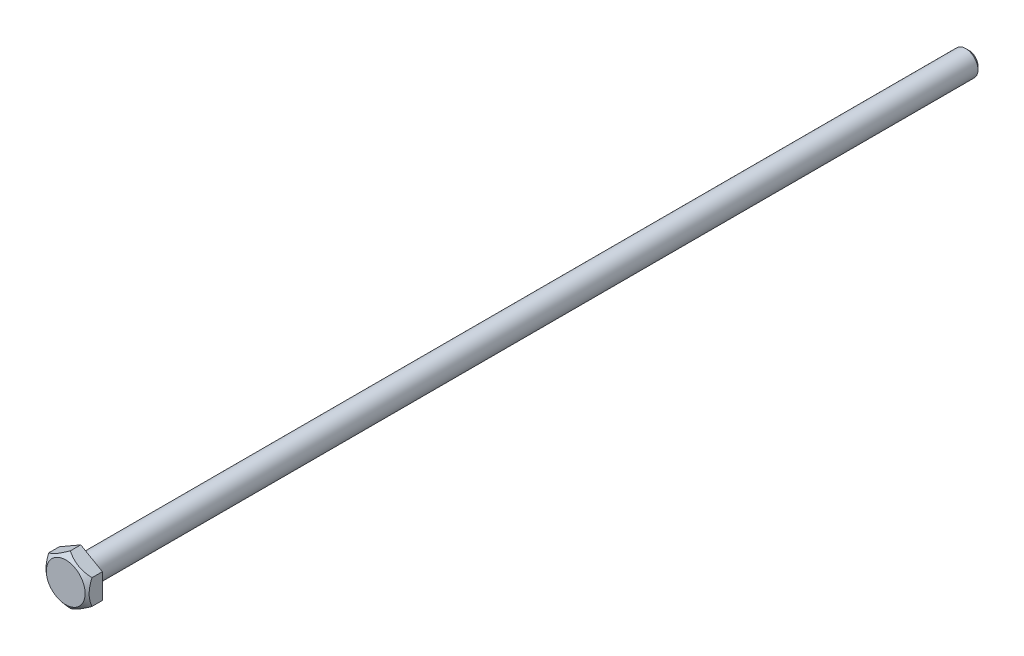
ISO-10303-21;
HEADER;
FILE_DESCRIPTION(('STEP AP214'),'2;1');
FILE_NAME('part.step','',(''),(''),'','','');
FILE_SCHEMA(('AUTOMOTIVE_DESIGN { 1 0 10303 214 1 1 1 1 }'));
ENDSEC;
DATA;
#1=APPLICATION_CONTEXT('core data for automotive mechanical design processes');
#2=APPLICATION_PROTOCOL_DEFINITION('international standard','automotive_design',2000,#1);
#3=PRODUCT_CONTEXT('',#1,'mechanical');
#4=PRODUCT('Part','Part','',(#3));
#5=PRODUCT_RELATED_PRODUCT_CATEGORY('part','',(#4));
#6=PRODUCT_DEFINITION_FORMATION('','',#4);
#7=PRODUCT_DEFINITION_CONTEXT('part definition',#1,'design');
#8=PRODUCT_DEFINITION('design','',#6,#7);
#9=PRODUCT_DEFINITION_SHAPE('','',#8);
#10=(LENGTH_UNIT() NAMED_UNIT(*) SI_UNIT(.MILLI.,.METRE.));
#11=(NAMED_UNIT(*) PLANE_ANGLE_UNIT() SI_UNIT($,.RADIAN.));
#12=(NAMED_UNIT(*) SI_UNIT($,.STERADIAN.) SOLID_ANGLE_UNIT());
#13=UNCERTAINTY_MEASURE_WITH_UNIT(LENGTH_MEASURE(1.E-05),#10,'distance_accuracy_value','');
#14=(GEOMETRIC_REPRESENTATION_CONTEXT(3) GLOBAL_UNCERTAINTY_ASSIGNED_CONTEXT((#13)) GLOBAL_UNIT_ASSIGNED_CONTEXT((#10,
#11,#12)) REPRESENTATION_CONTEXT('',''));
#15=CARTESIAN_POINT('',(0.,0.,0.));
#16=DIRECTION('',(0.,0.,1.));
#17=DIRECTION('',(1.,0.,0.));
#18=AXIS2_PLACEMENT_3D('',#15,#16,#17);
#19=CARTESIAN_POINT('',(0.,0.,0.));
#20=DIRECTION('',(0.,0.,1.));
#21=DIRECTION('',(1.,0.,0.));
#22=AXIS2_PLACEMENT_3D('',#19,#20,#21);
#23=PLANE('',#22);
#24=CARTESIAN_POINT('',(0.,0.,0.));
#25=DIRECTION('',(0.,0.,-1.));
#26=DIRECTION('',(-1.,0.,0.));
#27=AXIS2_PLACEMENT_3D('',#24,#25,#26);
#28=CIRCLE('',#27,3.17500000000001);
#29=CARTESIAN_POINT('',(-3.17500000000001,0.,0.));
#30=VERTEX_POINT('',#29);
#31=EDGE_CURVE('E112',#30,#30,#28,.T.);
#32=ORIENTED_EDGE('',*,*,#31,.F.);
#33=EDGE_LOOP('',(#32));
#34=FACE_BOUND('',#33,.T.);
#35=CARTESIAN_POINT('',(0.,0.,0.));
#36=DIRECTION('',(0.,0.,-1.));
#37=DIRECTION('',(-1.,0.,0.));
#38=AXIS2_PLACEMENT_3D('',#35,#36,#37);
#39=CIRCLE('',#38,5.2784375);
#40=CARTESIAN_POINT('',(-5.2784375,0.,0.));
#41=VERTEX_POINT('',#40);
#42=EDGE_CURVE('E133',#41,#41,#39,.T.);
#43=ORIENTED_EDGE('',*,*,#42,.T.);
#44=EDGE_LOOP('',(#43));
#45=FACE_BOUND('',#44,.T.);
#46=ADVANCED_FACE('F37',(#34,#45),#23,.F.);
#47=CARTESIAN_POINT('',(0.,2.28600000000002,-228.6));
#48=DIRECTION('',(0.,0.,-1.));
#49=DIRECTION('',(-1.,0.,0.));
#50=AXIS2_PLACEMENT_3D('',#47,#48,#49);
#51=PLANE('',#50);
#52=CARTESIAN_POINT('',(0.,0.,-228.6));
#53=DIRECTION('',(0.,0.,-1.));
#54=DIRECTION('',(-1.,0.,0.));
#55=AXIS2_PLACEMENT_3D('',#52,#53,#54);
#56=CIRCLE('',#55,2.28600000000002);
#57=CARTESIAN_POINT('',(-2.28600000000002,0.,-228.6));
#58=VERTEX_POINT('',#57);
#59=EDGE_CURVE('E118',#58,#58,#56,.T.);
#60=ORIENTED_EDGE('',*,*,#59,.T.);
#61=EDGE_LOOP('',(#60));
#62=FACE_BOUND('',#61,.T.);
#63=ADVANCED_FACE('F39',(#62),#51,.T.);
#64=CARTESIAN_POINT('',(0.,0.,-228.6));
#65=DIRECTION('',(0.,0.,-1.));
#66=DIRECTION('',(-1.,0.,0.));
#67=AXIS2_PLACEMENT_3D('',#64,#65,#66);
#68=CYLINDRICAL_SURFACE('',#67,3.17500000000001);
#69=ORIENTED_EDGE('',*,*,#31,.T.);
#70=EDGE_LOOP('',(#69));
#71=FACE_BOUND('',#70,.T.);
#72=CARTESIAN_POINT('',(0.,0.,-227.711));
#73=DIRECTION('',(0.,0.,-1.));
#74=DIRECTION('',(-1.,0.,0.));
#75=AXIS2_PLACEMENT_3D('',#72,#73,#74);
#76=CIRCLE('',#75,3.17500000000001);
#77=CARTESIAN_POINT('',(-3.17500000000001,0.,-227.711));
#78=VERTEX_POINT('',#77);
#79=EDGE_CURVE('E45',#78,#78,#76,.T.);
#80=ORIENTED_EDGE('',*,*,#79,.F.);
#81=EDGE_LOOP('',(#80));
#82=FACE_BOUND('',#81,.T.);
#83=ADVANCED_FACE('F125',(#71,#82),#68,.T.);
#84=CARTESIAN_POINT('',(0.,0.,-228.6));
#85=DIRECTION('',(0.,0.,1.));
#86=DIRECTION('',(1.,0.,0.));
#87=AXIS2_PLACEMENT_3D('',#84,#85,#86);
#88=CONICAL_SURFACE('',#87,2.28600000000002,0.785398163397431);
#89=ORIENTED_EDGE('',*,*,#79,.T.);
#90=EDGE_LOOP('',(#89));
#91=FACE_BOUND('',#90,.T.);
#92=ORIENTED_EDGE('',*,*,#59,.F.);
#93=EDGE_LOOP('',(#92));
#94=FACE_BOUND('',#93,.T.);
#95=ADVANCED_FACE('F214',(#91,#94),#88,.T.);
#96=CARTESIAN_POINT('',(0.,0.,0.09921875));
#97=DIRECTION('',(0.,0.,-1.));
#98=DIRECTION('',(-1.,0.,0.));
#99=AXIS2_PLACEMENT_3D('',#96,#97,#98);
#100=PLANE('',#99);
#101=CARTESIAN_POINT('',(0.,0.,0.09921875));
#102=DIRECTION('',(0.,0.,-1.));
#103=DIRECTION('',(-1.,0.,0.));
#104=AXIS2_PLACEMENT_3D('',#101,#102,#103);
#105=CIRCLE('',#104,5.2784375);
#106=CARTESIAN_POINT('',(-5.2784375,0.,0.09921875));
#107=VERTEX_POINT('',#106);
#108=EDGE_CURVE('E135',#107,#107,#105,.T.);
#109=ORIENTED_EDGE('',*,*,#108,.F.);
#110=EDGE_LOOP('',(#109));
#111=FACE_BOUND('',#110,.T.);
#112=DIRECTION('',(0.866025403784439,-0.499999999999999,0.));
#113=VECTOR('',#112,1.);
#114=CARTESIAN_POINT('',(5.55625,3.20790243318486,0.0992187499999999));
#115=LINE('',#114,#113);
#116=CARTESIAN_POINT('',(0.,6.41580486636971,0.09921875));
#117=VERTEX_POINT('',#116);
#118=CARTESIAN_POINT('',(5.55625,3.20790243318486,0.0992187499999999));
#119=VERTEX_POINT('',#118);
#120=EDGE_CURVE('E51',#117,#119,#115,.T.);
#121=ORIENTED_EDGE('',*,*,#120,.T.);
#122=DIRECTION('',(0.,-1.,0.));
#123=VECTOR('',#122,1.);
#124=CARTESIAN_POINT('',(5.55625,-3.20790243318486,0.0992187499999999));
#125=LINE('',#124,#123);
#126=CARTESIAN_POINT('',(5.55625,-3.20790243318485,0.09921875));
#127=VERTEX_POINT('',#126);
#128=EDGE_CURVE('E12',#119,#127,#125,.T.);
#129=ORIENTED_EDGE('',*,*,#128,.T.);
#130=DIRECTION('',(-0.866025403784438,-0.5,0.));
#131=VECTOR('',#130,1.);
#132=CARTESIAN_POINT('',(0.,-6.41580486636972,0.0992187499999999));
#133=LINE('',#132,#131);
#134=CARTESIAN_POINT('',(0.,-6.41580486636971,0.09921875));
#135=VERTEX_POINT('',#134);
#136=EDGE_CURVE('E138',#127,#135,#133,.T.);
#137=ORIENTED_EDGE('',*,*,#136,.T.);
#138=DIRECTION('',(-0.866025403784439,0.5,0.));
#139=VECTOR('',#138,1.);
#140=CARTESIAN_POINT('',(-5.55625,-3.20790243318486,0.0992187499999999));
#141=LINE('',#140,#139);
#142=CARTESIAN_POINT('',(-5.55625,-3.20790243318486,0.09921875));
#143=VERTEX_POINT('',#142);
#144=EDGE_CURVE('E92',#135,#143,#141,.T.);
#145=ORIENTED_EDGE('',*,*,#144,.T.);
#146=DIRECTION('',(0.,1.,0.));
#147=VECTOR('',#146,1.);
#148=CARTESIAN_POINT('',(-5.55625,3.20790243318485,0.0992187499999999));
#149=LINE('',#148,#147);
#150=CARTESIAN_POINT('',(-5.55625,3.20790243318485,0.09921875));
#151=VERTEX_POINT('',#150);
#152=EDGE_CURVE('E87',#143,#151,#149,.T.);
#153=ORIENTED_EDGE('',*,*,#152,.T.);
#154=DIRECTION('',(0.866025403784438,0.5,0.));
#155=VECTOR('',#154,1.);
#156=CARTESIAN_POINT('',(0.,6.41580486636971,0.0992187499999999));
#157=LINE('',#156,#155);
#158=EDGE_CURVE('E90',#151,#117,#157,.T.);
#159=ORIENTED_EDGE('',*,*,#158,.T.);
#160=EDGE_LOOP('',(#121,#129,#137,#145,#153,#159));
#161=FACE_BOUND('',#160,.T.);
#162=ADVANCED_FACE('F89',(#111,#161),#100,.T.);
#163=CARTESIAN_POINT('',(0.,0.,0.09921875));
#164=DIRECTION('',(0.,0.,-1.));
#165=DIRECTION('',(-1.,0.,0.));
#166=AXIS2_PLACEMENT_3D('',#163,#164,#165);
#167=CYLINDRICAL_SURFACE('',#166,5.2784375);
#168=ORIENTED_EDGE('',*,*,#108,.T.);
#169=EDGE_LOOP('',(#168));
#170=FACE_BOUND('',#169,.T.);
#171=ORIENTED_EDGE('',*,*,#42,.F.);
#172=EDGE_LOOP('',(#171));
#173=FACE_BOUND('',#172,.T.);
#174=ADVANCED_FACE('F249',(#170,#173),#167,.T.);
#175=CARTESIAN_POINT('',(0.,0.,3.96875));
#176=DIRECTION('',(0.,0.,1.));
#177=DIRECTION('',(1.,0.,0.));
#178=AXIS2_PLACEMENT_3D('',#175,#176,#177);
#179=PLANE('',#178);
#180=CARTESIAN_POINT('',(0.,0.,3.96875));
#181=DIRECTION('',(0.,0.,1.));
#182=DIRECTION('',(1.,0.,0.));
#183=AXIS2_PLACEMENT_3D('',#180,#181,#182);
#184=CIRCLE('',#183,5.000625);
#185=CARTESIAN_POINT('',(5.000625,0.,3.96875));
#186=VERTEX_POINT('',#185);
#187=EDGE_CURVE('E144',#186,#186,#184,.T.);
#188=ORIENTED_EDGE('',*,*,#187,.T.);
#189=EDGE_LOOP('',(#188));
#190=FACE_BOUND('',#189,.T.);
#191=ADVANCED_FACE('F168',(#190),#179,.T.);
#192=CARTESIAN_POINT('',(0.,0.,3.96875));
#193=DIRECTION('',(0.,0.,-1.));
#194=DIRECTION('',(1.,0.,0.));
#195=AXIS2_PLACEMENT_3D('',#192,#193,#194);
#196=CONICAL_SURFACE('',#195,5.000625,0.872664625997167);
#197=ORIENTED_EDGE('',*,*,#187,.F.);
#198=EDGE_LOOP('',(#197));
#199=FACE_BOUND('',#198,.T.);
#200=CARTESIAN_POINT('',(5.55645,3.20778696313102,2.7811762025844));
#201=CARTESIAN_POINT('',(5.36942287800813,3.31576712235879,2.87174290189446));
#202=CARTESIAN_POINT('',(5.1801128777987,3.42506530193999,2.95664630651463));
#203=CARTESIAN_POINT('',(4.79640245001475,3.64660062071192,3.11186256826474));
#204=CARTESIAN_POINT('',(4.60198750929482,3.75884613907106,3.1821272314966));
#205=CARTESIAN_POINT('',(4.21055743956502,3.98483839519847,3.30361001362993));
#206=CARTESIAN_POINT('',(4.01358244229918,4.09856196289353,3.35499670765096));
#207=CARTESIAN_POINT('',(3.61644186020743,4.32785118487032,3.43602242404382));
#208=CARTESIAN_POINT('',(3.4162804755603,4.44341441417771,3.46568798738072));
#209=CARTESIAN_POINT('',(3.11317047330776,4.61841505557229,3.4922840094219));
#210=CARTESIAN_POINT('',(3.01076766145363,4.67753734656204,3.49813640306416));
#211=CARTESIAN_POINT('',(2.80583237176032,4.79585679123293,3.50350262433152));
#212=CARTESIAN_POINT('',(2.70329989840131,4.85505394232743,3.50301666528673));
#213=CARTESIAN_POINT('',(2.49836808386294,4.97337138061668,3.49570688780427));
#214=CARTESIAN_POINT('',(2.39596880596456,5.03249163127613,3.48888072486892));
#215=CARTESIAN_POINT('',(2.19161413080256,5.15047585799107,3.46905431832034));
#216=CARTESIAN_POINT('',(2.08965879940889,5.20933979601652,3.45605318802658));
#217=CARTESIAN_POINT('',(1.78488763429259,5.38529951023765,3.40819419699572));
#218=CARTESIAN_POINT('',(1.58308217780571,5.50181194486429,3.36447734474451));
#219=CARTESIAN_POINT('',(1.18361180278695,5.73244627341465,3.25674845339603));
#220=CARTESIAN_POINT('',(0.985948685577069,5.84656712734463,3.1927277725839));
#221=CARTESIAN_POINT('',(0.656416529823367,6.03682260617567,3.07083683041339));
#222=CARTESIAN_POINT('',(0.523316938331222,6.11366769115269,3.01731243824081));
#223=CARTESIAN_POINT('',(0.325533109905479,6.22785823773565,2.93215622440135));
#224=CARTESIAN_POINT('',(0.26003610932506,6.26567294865186,2.90301786600498));
#225=CARTESIAN_POINT('',(0.129541330587996,6.34101414428355,2.843211119322));
#226=CARTESIAN_POINT('',(0.0645437343024629,6.37854052399568,2.8125422015325));
#227=CARTESIAN_POINT('',(-0.000200000000004958,6.41592033642355,2.7811762025844));
#228=B_SPLINE_CURVE_WITH_KNOTS('',3,(#200,#201,#202,#203,#204,#205,#206,#207,#208,#209,#210,
#211,#212,#213,#214,#215,#216,#217,#218,#219,#220,#221,#222,#223,#224,#225,#226,#227),
.UNSPECIFIED.,.F.,.F.,(4,2,2,2,2,2,2,2,2,2,2,2,2,4),(0.,0.702831010465649,1.40794055081247,
2.10659111417631,2.80438656798393,3.15940882068105,3.51441912441572,3.8695607571038,
4.22475340097869,4.9348473642946,5.64524396430246,6.13330928727615,6.37643981877862,
6.61965505331136),.UNSPECIFIED.);
#229=CARTESIAN_POINT('',(5.55625,3.20790243318544,2.78127309607981));
#230=VERTEX_POINT('',#229);
#231=CARTESIAN_POINT('',(0.,6.41580486636971,2.78127309607966));
#232=VERTEX_POINT('',#231);
#233=EDGE_CURVE('E174',#230,#232,#228,.T.);
#234=ORIENTED_EDGE('',*,*,#233,.T.);
#235=CARTESIAN_POINT('',(0.000199999999995729,6.41592033642355,2.7811762025844));
#236=CARTESIAN_POINT('',(-0.186827121991873,6.30794017719579,2.87174290189446));
#237=CARTESIAN_POINT('',(-0.376137122201302,6.19864199761458,2.95664630651463));
#238=CARTESIAN_POINT('',(-0.759847549985247,5.97710667884266,3.11186256826474));
#239=CARTESIAN_POINT('',(-0.954262490705186,5.86486116048351,3.1821272314966));
#240=CARTESIAN_POINT('',(-1.34569256043498,5.6388689043561,3.30361001362993));
#241=CARTESIAN_POINT('',(-1.54266755770082,5.52514533666104,3.35499670765096));
#242=CARTESIAN_POINT('',(-1.93980813979257,5.29585611468425,3.43602242404382));
#243=CARTESIAN_POINT('',(-2.1399695244397,5.18029288537686,3.46568798738072));
#244=CARTESIAN_POINT('',(-2.44307952669225,5.00529224398228,3.4922840094219));
#245=CARTESIAN_POINT('',(-2.54548233854637,4.94616995299253,3.49813640306416));
#246=CARTESIAN_POINT('',(-2.75041762823968,4.82785050832164,3.50350262433152));
#247=CARTESIAN_POINT('',(-2.85295010159869,4.76865335722714,3.50301666528673));
#248=CARTESIAN_POINT('',(-3.05788191613706,4.65033591893789,3.49570688780427));
#249=CARTESIAN_POINT('',(-3.16028119403544,4.59121566827844,3.48888072486892));
#250=CARTESIAN_POINT('',(-3.36463586919744,4.4732314415635,3.46905431832034));
#251=CARTESIAN_POINT('',(-3.46659120059111,4.41436750353805,3.45605318802658));
#252=CARTESIAN_POINT('',(-3.77136236570741,4.23840778931692,3.40819419699572));
#253=CARTESIAN_POINT('',(-3.97316782219429,4.12189535469028,3.36447734474451));
#254=CARTESIAN_POINT('',(-4.37263819721305,3.89126102613992,3.25674845339603));
#255=CARTESIAN_POINT('',(-4.57030131442293,3.77714017220993,3.1927277725839));
#256=CARTESIAN_POINT('',(-4.89983347017663,3.5868846933789,3.07083683041339));
#257=CARTESIAN_POINT('',(-5.03293306166878,3.51003960840188,3.01731243824081));
#258=CARTESIAN_POINT('',(-5.23071689009452,3.39584906181892,2.93215622440135));
#259=CARTESIAN_POINT('',(-5.29621389067494,3.3580343509027,2.90301786600498));
#260=CARTESIAN_POINT('',(-5.426708669412,3.28269315527102,2.843211119322));
#261=CARTESIAN_POINT('',(-5.49170626569753,3.24516677555889,2.8125422015325));
#262=CARTESIAN_POINT('',(-5.55645,3.20778696313102,2.7811762025844));
#263=B_SPLINE_CURVE_WITH_KNOTS('',3,(#235,#236,#237,#238,#239,#240,#241,#242,#243,#244,#245,
#246,#247,#248,#249,#250,#251,#252,#253,#254,#255,#256,#257,#258,#259,#260,#261,#262),
.UNSPECIFIED.,.F.,.F.,(4,2,2,2,2,2,2,2,2,2,2,2,2,4),(0.,0.702831010465648,1.40794055081247,
2.10659111417631,2.80438656798393,3.15940882068105,3.51441912441572,3.8695607571038,
4.22475340097869,4.9348473642946,5.64524396430246,6.13330928727615,6.37643981877862,
6.61965505331136),.UNSPECIFIED.);
#264=CARTESIAN_POINT('',(-5.55625,3.20790243318544,2.78127309607981));
#265=VERTEX_POINT('',#264);
#266=EDGE_CURVE('E197',#232,#265,#263,.T.);
#267=ORIENTED_EDGE('',*,*,#266,.T.);
#268=CARTESIAN_POINT('',(-5.55625,-7.30613663453006,0.462791093083608));
#269=CARTESIAN_POINT('',(-5.55625,-7.12020973770685,0.586942504252101));
#270=CARTESIAN_POINT('',(-5.55625,-6.93349824589019,0.709937814159239));
#271=CARTESIAN_POINT('',(-5.55625,-6.55815980741665,0.953055675693383));
#272=CARTESIAN_POINT('',(-5.55625,-6.36953246148676,1.07317761023776));
#273=CARTESIAN_POINT('',(-5.55625,-5.98877139991501,1.31076066086805));
#274=CARTESIAN_POINT('',(-5.55625,-5.79662240300522,1.42819736790077));
#275=CARTESIAN_POINT('',(-5.55625,-5.40973702167827,1.65871402414128));
#276=CARTESIAN_POINT('',(-5.55625,-5.21500079738226,1.7717942412946));
#277=CARTESIAN_POINT('',(-5.55625,-4.81174502393942,1.99860663449565));
#278=CARTESIAN_POINT('',(-5.55625,-4.60305427607429,2.11203600056159));
#279=CARTESIAN_POINT('',(-5.55625,-4.18166409396964,2.33131613610535));
#280=CARTESIAN_POINT('',(-5.55625,-3.96896407627944,2.43716579161728));
#281=CARTESIAN_POINT('',(-5.55625,-3.53953841813976,2.63889062035672));
#282=CARTESIAN_POINT('',(-5.55625,-3.32282501792204,2.73479162618935));
#283=CARTESIAN_POINT('',(-5.55625,-2.88437062163604,2.91420067485783));
#284=CARTESIAN_POINT('',(-5.55625,-2.6626317338622,2.99771380764493));
#285=CARTESIAN_POINT('',(-5.55625,-2.21904432381386,3.14727736625022));
#286=CARTESIAN_POINT('',(-5.55625,-1.99732009111652,3.21369108973883));
#287=CARTESIAN_POINT('',(-5.55625,-1.54907698527521,3.32803156373685));
#288=CARTESIAN_POINT('',(-5.55625,-1.32255845489672,3.37595963118926));
#289=CARTESIAN_POINT('',(-5.55625,-0.87022264424084,3.44928939349749));
#290=CARTESIAN_POINT('',(-5.55625,-0.644473061991863,3.47509981381762));
#291=CARTESIAN_POINT('',(-5.55625,-0.191501887582105,3.5036028744068));
#292=CARTESIAN_POINT('',(-5.55625,0.0357195286344082,3.50629822863319));
#293=CARTESIAN_POINT('',(-5.55625,0.472434488391589,3.48901850551984));
#294=CARTESIAN_POINT('',(-5.55625,0.681996959984805,3.47070441531755));
#295=CARTESIAN_POINT('',(-5.55625,1.09860731025216,3.41540133303354));
#296=CARTESIAN_POINT('',(-5.55625,1.30565500844794,3.37841100862522));
#297=CARTESIAN_POINT('',(-5.55625,1.7204729739798,3.28708537520144));
#298=CARTESIAN_POINT('',(-5.55625,1.92816452143712,3.23239705931333));
#299=CARTESIAN_POINT('',(-5.55625,2.23638685185959,3.13968443975248));
#300=CARTESIAN_POINT('',(-5.55625,2.33857192969291,3.10700141946752));
#301=CARTESIAN_POINT('',(-5.55625,2.54185150655202,3.03841158687913));
#302=CARTESIAN_POINT('',(-5.55625,2.64294605057579,3.00250490816576));
#303=CARTESIAN_POINT('',(-5.55625,2.94108641581461,2.89174822540753));
#304=CARTESIAN_POINT('',(-5.55625,3.13659642966695,2.81275113672164));
#305=CARTESIAN_POINT('',(-5.55625,3.52375299718132,2.64574387779957));
#306=CARTESIAN_POINT('',(-5.55625,3.71539829221819,2.55773082630378));
#307=CARTESIAN_POINT('',(-5.55625,4.09541763878012,2.37436691962321));
#308=CARTESIAN_POINT('',(-5.55625,4.28378738398456,2.27900718588948));
#309=CARTESIAN_POINT('',(-5.55625,4.65742469570359,2.08246699995644));
#310=CARTESIAN_POINT('',(-5.55625,4.84269257054241,1.98128713076365));
#311=CARTESIAN_POINT('',(-5.55625,5.21172117135056,1.77354751044707));
#312=CARTESIAN_POINT('',(-5.55625,5.39546496722467,1.66695779464702));
#313=CARTESIAN_POINT('',(-5.55625,5.76063319278679,1.44986704172048));
#314=CARTESIAN_POINT('',(-5.55625,5.94205749908233,1.33936579767687));
#315=CARTESIAN_POINT('',(-5.55625,6.3027826054028,1.11522193375078));
#316=CARTESIAN_POINT('',(-5.55625,6.4820847427773,1.0015814612717));
#317=CARTESIAN_POINT('',(-5.55625,6.83896784115723,0.771626233299551));
#318=CARTESIAN_POINT('',(-5.55625,7.01654876260732,0.655311416553422));
#319=CARTESIAN_POINT('',(-5.55625,7.5087821524307,0.328443095819789));
#320=CARTESIAN_POINT('',(-5.55625,7.82181835713223,0.115455906973559));
#321=CARTESIAN_POINT('',(-5.55625,8.44427371229476,-0.315820081022643));
#322=CARTESIAN_POINT('',(-5.55625,8.75369227194872,-0.534109728699571));
#323=CARTESIAN_POINT('',(-5.55625,9.36548048863519,-0.971744247536536));
#324=CARTESIAN_POINT('',(-5.55625,9.66788890120855,-1.19103502023525));
#325=CARTESIAN_POINT('',(-5.55625,10.1197707024566,-1.52224374148086));
#326=CARTESIAN_POINT('',(-5.55625,10.270090128778,-1.6330109049258));
#327=CARTESIAN_POINT('',(-5.55625,10.570218718119,-1.85523158495491));
#328=CARTESIAN_POINT('',(-5.55625,10.7200278858836,-1.96668509512955));
#329=CARTESIAN_POINT('',(-5.55625,10.8696100113442,-2.07844265914501));
#330=B_SPLINE_CURVE_WITH_KNOTS('',3,(#268,#269,#270,#271,#272,#273,#274,#275,#276,#277,#278,
#279,#280,#281,#282,#283,#284,#285,#286,#287,#288,#289,#290,#291,#292,#293,#294,#295,#296,#297,
#298,#299,#300,#301,#302,#303,#304,#305,#306,#307,#308,#309,#310,#311,#312,#313,#314,#315,#316,
#317,#318,#319,#320,#321,#322,#323,#324,#325,#326,#327,#328,#329),.UNSPECIFIED.,.F.,.F.,(4,2,2,
2,2,2,2,2,2,2,2,2,2,2,2,2,2,2,2,2,2,2,2,2,2,2,2,2,2,2,4),(0.,0.670713465897782,1.34156970318055,
2.01710606570588,2.69260081287778,3.40505238162959,4.11760844312781,4.82826536266456,
5.5386294725557,6.2323501589939,6.92602141470503,7.60657902178047,8.28705672298004,
8.91723605757904,9.54746035431262,10.1911220511409,10.5129324091891,10.8347294374005,
11.4670184796742,12.0995102186696,12.7327786973341,13.3659838512028,14.0031916629135,
14.6404332329985,15.2772491923602,15.9140797518851,17.0498662469218,18.1858357096178,
19.3064582013904,19.8666242570968,20.426785089535),.UNSPECIFIED.);
#331=CARTESIAN_POINT('',(-5.55625,-3.20790243318486,2.78127309607966));
#332=VERTEX_POINT('',#331);
#333=EDGE_CURVE('E109',#265,#332,#330,.F.);
#334=ORIENTED_EDGE('',*,*,#333,.T.);
#335=CARTESIAN_POINT('',(-5.55645,-3.20778696313102,2.78117620258439));
#336=CARTESIAN_POINT('',(-5.36942287800813,-3.31576712235879,2.87174290189446));
#337=CARTESIAN_POINT('',(-5.1801128777987,-3.42506530193999,2.95664630651463));
#338=CARTESIAN_POINT('',(-4.79640245001476,-3.64660062071192,3.11186256826474));
#339=CARTESIAN_POINT('',(-4.60198750929482,-3.75884613907106,3.1821272314966));
#340=CARTESIAN_POINT('',(-4.21055743956502,-3.98483839519847,3.30361001362993));
#341=CARTESIAN_POINT('',(-4.01358244229918,-4.09856196289353,3.35499670765096));
#342=CARTESIAN_POINT('',(-3.61644186020744,-4.32785118487032,3.43602242404382));
#343=CARTESIAN_POINT('',(-3.4162804755603,-4.44341441417771,3.46568798738072));
#344=CARTESIAN_POINT('',(-3.11317047330776,-4.61841505557229,3.4922840094219));
#345=CARTESIAN_POINT('',(-3.01076766145363,-4.67753734656204,3.49813640306415));
#346=CARTESIAN_POINT('',(-2.80583237176032,-4.79585679123293,3.50350262433152));
#347=CARTESIAN_POINT('',(-2.70329989840131,-4.85505394232743,3.50301666528673));
#348=CARTESIAN_POINT('',(-2.49836808386294,-4.97337138061668,3.49570688780427));
#349=CARTESIAN_POINT('',(-2.39596880596456,-5.03249163127613,3.48888072486892));
#350=CARTESIAN_POINT('',(-2.19161413080256,-5.15047585799107,3.46905431832034));
#351=CARTESIAN_POINT('',(-2.08965879940889,-5.20933979601652,3.45605318802658));
#352=CARTESIAN_POINT('',(-1.78488763429259,-5.38529951023766,3.40819419699572));
#353=CARTESIAN_POINT('',(-1.58308217780571,-5.50181194486429,3.36447734474451));
#354=CARTESIAN_POINT('',(-1.18361180278695,-5.73244627341465,3.25674845339602));
#355=CARTESIAN_POINT('',(-0.985948685577068,-5.84656712734464,3.1927277725839));
#356=CARTESIAN_POINT('',(-0.656416529823365,-6.03682260617567,3.07083683041338));
#357=CARTESIAN_POINT('',(-0.523316938331221,-6.11366769115269,3.01731243824081));
#358=CARTESIAN_POINT('',(-0.32553310990548,-6.22785823773565,2.93215622440135));
#359=CARTESIAN_POINT('',(-0.260036109325062,-6.26567294865187,2.90301786600498));
#360=CARTESIAN_POINT('',(-0.129541330587998,-6.34101414428355,2.843211119322));
#361=CARTESIAN_POINT('',(-0.0645437343024653,-6.37854052399568,2.8125422015325));
#362=CARTESIAN_POINT('',(0.000200000000002756,-6.41592033642355,2.7811762025844));
#363=B_SPLINE_CURVE_WITH_KNOTS('',3,(#335,#336,#337,#338,#339,#340,#341,#342,#343,#344,#345,
#346,#347,#348,#349,#350,#351,#352,#353,#354,#355,#356,#357,#358,#359,#360,#361,#362),
.UNSPECIFIED.,.F.,.F.,(4,2,2,2,2,2,2,2,2,2,2,2,2,4),(0.,0.702831010465649,1.40794055081247,
2.10659111417631,2.80438656798394,3.15940882068106,3.51441912441572,3.8695607571038,
4.22475340097869,4.9348473642946,5.64524396430247,6.13330928727615,6.37643981877862,
6.61965505331136),.UNSPECIFIED.);
#364=CARTESIAN_POINT('',(0.,-6.41580486636972,2.78127309607966));
#365=VERTEX_POINT('',#364);
#366=EDGE_CURVE('E185',#332,#365,#363,.T.);
#367=ORIENTED_EDGE('',*,*,#366,.T.);
#368=CARTESIAN_POINT('',(-0.000199999999997339,-6.41592033642355,2.7811762025844));
#369=CARTESIAN_POINT('',(0.186827121991871,-6.30794017719579,2.87174290189446));
#370=CARTESIAN_POINT('',(0.3761371222013,-6.19864199761459,2.95664630651463));
#371=CARTESIAN_POINT('',(0.759847549985245,-5.97710667884266,3.11186256826474));
#372=CARTESIAN_POINT('',(0.954262490705184,-5.86486116048352,3.1821272314966));
#373=CARTESIAN_POINT('',(1.34569256043498,-5.63886890435611,3.30361001362993));
#374=CARTESIAN_POINT('',(1.54266755770082,-5.52514533666105,3.35499670765096));
#375=CARTESIAN_POINT('',(1.93980813979257,-5.29585611468425,3.43602242404382));
#376=CARTESIAN_POINT('',(2.1399695244397,-5.18029288537686,3.46568798738072));
#377=CARTESIAN_POINT('',(2.44307952669224,-5.00529224398229,3.4922840094219));
#378=CARTESIAN_POINT('',(2.54548233854637,-4.94616995299253,3.49813640306415));
#379=CARTESIAN_POINT('',(2.75041762823968,-4.82785050832165,3.50350262433152));
#380=CARTESIAN_POINT('',(2.85295010159869,-4.76865335722714,3.50301666528673));
#381=CARTESIAN_POINT('',(3.05788191613706,-4.6503359189379,3.49570688780427));
#382=CARTESIAN_POINT('',(3.16028119403544,-4.59121566827844,3.48888072486892));
#383=CARTESIAN_POINT('',(3.36463586919744,-4.4732314415635,3.46905431832034));
#384=CARTESIAN_POINT('',(3.46659120059111,-4.41436750353805,3.45605318802658));
#385=CARTESIAN_POINT('',(3.77136236570741,-4.23840778931692,3.40819419699572));
#386=CARTESIAN_POINT('',(3.97316782219429,-4.12189535469028,3.36447734474451));
#387=CARTESIAN_POINT('',(4.37263819721305,-3.89126102613992,3.25674845339603));
#388=CARTESIAN_POINT('',(4.57030131442293,-3.77714017220994,3.1927277725839));
#389=CARTESIAN_POINT('',(4.89983347017663,-3.5868846933789,3.07083683041338));
#390=CARTESIAN_POINT('',(5.03293306166878,-3.51003960840188,3.01731243824081));
#391=CARTESIAN_POINT('',(5.23071689009452,-3.39584906181892,2.93215622440135));
#392=CARTESIAN_POINT('',(5.29621389067494,-3.35803435090271,2.90301786600498));
#393=CARTESIAN_POINT('',(5.426708669412,-3.28269315527102,2.843211119322));
#394=CARTESIAN_POINT('',(5.49170626569753,-3.24516677555889,2.8125422015325));
#395=CARTESIAN_POINT('',(5.55645,-3.20778696313102,2.7811762025844));
#396=B_SPLINE_CURVE_WITH_KNOTS('',3,(#368,#369,#370,#371,#372,#373,#374,#375,#376,#377,#378,
#379,#380,#381,#382,#383,#384,#385,#386,#387,#388,#389,#390,#391,#392,#393,#394,#395),
.UNSPECIFIED.,.F.,.F.,(4,2,2,2,2,2,2,2,2,2,2,2,2,4),(0.,0.702831010465648,1.40794055081247,
2.10659111417631,2.80438656798393,3.15940882068105,3.51441912441572,3.8695607571038,
4.22475340097869,4.9348473642946,5.64524396430247,6.13330928727615,6.37643981877862,
6.61965505331136),.UNSPECIFIED.);
#397=CARTESIAN_POINT('',(5.55625,-3.20790243318486,2.78127309607966));
#398=VERTEX_POINT('',#397);
#399=EDGE_CURVE('E59',#365,#398,#396,.T.);
#400=ORIENTED_EDGE('',*,*,#399,.T.);
#401=CARTESIAN_POINT('',(5.55625,-7.30613663453342,0.462791093081361));
#402=CARTESIAN_POINT('',(5.55625,-7.12020973771012,0.586942504249942));
#403=CARTESIAN_POINT('',(5.55625,-6.93349824589335,0.709937814157169));
#404=CARTESIAN_POINT('',(5.55625,-6.5581598074196,0.95305567569149));
#405=CARTESIAN_POINT('',(5.55625,-6.36953246148961,1.07317761023595));
#406=CARTESIAN_POINT('',(5.55625,-5.98877139991765,1.31076066086643));
#407=CARTESIAN_POINT('',(5.55625,-5.79662240300776,1.42819736789923));
#408=CARTESIAN_POINT('',(5.55625,-5.4097370216806,1.65871402413992));
#409=CARTESIAN_POINT('',(5.55625,-5.21500079738447,1.77179424129333));
#410=CARTESIAN_POINT('',(5.55625,-4.8117450239414,1.99860663449456));
#411=CARTESIAN_POINT('',(5.55625,-4.60305427607615,2.11203600056059));
#412=CARTESIAN_POINT('',(5.55625,-4.18166409397124,2.33131613610454));
#413=CARTESIAN_POINT('',(5.55625,-3.96896407628092,2.43716579161656));
#414=CARTESIAN_POINT('',(5.55625,-3.53953841814098,2.63889062035617));
#415=CARTESIAN_POINT('',(5.55625,-3.32282501792312,2.73479162618889));
#416=CARTESIAN_POINT('',(5.55625,-2.88437062163685,2.91420067485751));
#417=CARTESIAN_POINT('',(5.55625,-2.66263173386288,2.99771380764469));
#418=CARTESIAN_POINT('',(5.55625,-2.21904432381449,3.14727736625002));
#419=CARTESIAN_POINT('',(5.55625,-1.99732009111726,3.21369108973862));
#420=CARTESIAN_POINT('',(5.55625,-1.54907698527615,3.32803156373663));
#421=CARTESIAN_POINT('',(5.55625,-1.32255845489777,3.37595963118905));
#422=CARTESIAN_POINT('',(5.55625,-0.870222644242101,3.44928939349733));
#423=CARTESIAN_POINT('',(5.55625,-0.644473061993227,3.47509981381749));
#424=CARTESIAN_POINT('',(5.55625,-0.191501887583672,3.50360287440676));
#425=CARTESIAN_POINT('',(5.55625,0.0357195286327409,3.5062982286332));
#426=CARTESIAN_POINT('',(5.55625,0.472434488389777,3.48901850551997));
#427=CARTESIAN_POINT('',(5.55625,0.681996959982947,3.47070441531774));
#428=CARTESIAN_POINT('',(5.55625,1.09860731025022,3.41540133303386));
#429=CARTESIAN_POINT('',(5.55625,1.30565500844595,3.3784110086256));
#430=CARTESIAN_POINT('',(5.55625,1.72047297397774,3.28708537520196));
#431=CARTESIAN_POINT('',(5.55625,1.92816452143502,3.23239705931391));
#432=CARTESIAN_POINT('',(5.55625,2.23638685185743,3.13968443975316));
#433=CARTESIAN_POINT('',(5.55625,2.33857192969074,3.10700141946823));
#434=CARTESIAN_POINT('',(5.55625,2.54185150654981,3.0384115868799));
#435=CARTESIAN_POINT('',(5.55625,2.64294605057356,3.00250490816657));
#436=CARTESIAN_POINT('',(5.55625,2.9410864158121,2.89174822540852));
#437=CARTESIAN_POINT('',(5.55625,3.13659642966417,2.81275113672279));
#438=CARTESIAN_POINT('',(5.55625,3.52375299717802,2.64574387780105));
#439=CARTESIAN_POINT('',(5.55625,3.71539829221463,2.55773082630544));
#440=CARTESIAN_POINT('',(5.55625,4.09541763877606,2.37436691962523));
#441=CARTESIAN_POINT('',(5.55625,4.28378738398026,2.27900718589169));
#442=CARTESIAN_POINT('',(5.55625,4.65742469569879,2.08246699995903));
#443=CARTESIAN_POINT('',(5.55625,4.84269257053737,1.98128713076643));
#444=CARTESIAN_POINT('',(5.55625,5.21172117134504,1.77354751045024));
#445=CARTESIAN_POINT('',(5.55625,5.3954649672189,1.66695779465039));
#446=CARTESIAN_POINT('',(5.55625,5.76063319278055,1.44986704172426));
#447=CARTESIAN_POINT('',(5.55625,5.94205749907585,1.33936579768084));
#448=CARTESIAN_POINT('',(5.55625,6.30278260539584,1.11522193375516));
#449=CARTESIAN_POINT('',(5.55625,6.4820847427701,1.00158146127628));
#450=CARTESIAN_POINT('',(5.55625,6.83896784114957,0.771626233304545));
#451=CARTESIAN_POINT('',(5.55625,7.01654876259942,0.65531141655862));
#452=CARTESIAN_POINT('',(5.55625,7.50878215242222,0.328443095825512));
#453=CARTESIAN_POINT('',(5.55625,7.82181835712341,0.1154559069796));
#454=CARTESIAN_POINT('',(5.55625,8.44427371228524,-0.31582008101597));
#455=CARTESIAN_POINT('',(5.55625,8.75369227193886,-0.534109728692583));
#456=CARTESIAN_POINT('',(5.55625,9.36548048862464,-0.971744247528923));
#457=CARTESIAN_POINT('',(5.55625,9.66788890119766,-1.19103502022733));
#458=CARTESIAN_POINT('',(5.55625,10.1197707024452,-1.52224374147248));
#459=CARTESIAN_POINT('',(5.55625,10.2700901287664,-1.63301090491726));
#460=CARTESIAN_POINT('',(5.55625,10.5702187181071,-1.85523158494606));
#461=CARTESIAN_POINT('',(5.55625,10.7200278858716,-1.96668509512055));
#462=CARTESIAN_POINT('',(5.55625,10.8696100113319,-2.07844265913586));
#463=B_SPLINE_CURVE_WITH_KNOTS('',3,(#401,#402,#403,#404,#405,#406,#407,#408,#409,#410,#411,
#412,#413,#414,#415,#416,#417,#418,#419,#420,#421,#422,#423,#424,#425,#426,#427,#428,#429,#430,
#431,#432,#433,#434,#435,#436,#437,#438,#439,#440,#441,#442,#443,#444,#445,#446,#447,#448,#449,
#450,#451,#452,#453,#454,#455,#456,#457,#458,#459,#460,#461,#462),.UNSPECIFIED.,.F.,.F.,(4,2,2,
2,2,2,2,2,2,2,2,2,2,2,2,2,2,2,2,2,2,2,2,2,2,2,2,2,2,2,4),(0.,0.670713465898184,1.34156970318135,
2.01710606570709,2.6926008128794,3.40505238163168,4.11760844313036,4.82826536266758,
5.53862947255918,6.23235015899708,6.9260214147079,7.60657902178305,8.28705672298232,
8.91723605758117,9.54746035431461,10.1911220511427,10.5129324091909,10.8347294374022,
11.467018479675,12.0995102186695,12.732778697333,13.3659838512008,14.0031916629105,
14.6404332329947,15.2772491923554,15.9140797518794,17.0498662469147,18.1858357096093,
19.3064582013806,19.8666242570863,20.4267850895237),.UNSPECIFIED.);
#464=EDGE_CURVE('E147',#398,#230,#463,.T.);
#465=ORIENTED_EDGE('',*,*,#464,.T.);
#466=EDGE_LOOP('',(#234,#267,#334,#367,#400,#465));
#467=FACE_BOUND('',#466,.T.);
#468=ADVANCED_FACE('F163',(#199,#467),#196,.T.);
#469=CARTESIAN_POINT('',(5.55625,-3.20790243318486,3.96875));
#470=DIRECTION('',(-1.,0.,0.));
#471=DIRECTION('',(0.,-1.,0.));
#472=AXIS2_PLACEMENT_3D('',#469,#470,#471);
#473=PLANE('',#472);
#474=ORIENTED_EDGE('',*,*,#128,.F.);
#475=DIRECTION('',(0.,0.,-1.));
#476=VECTOR('',#475,1.);
#477=CARTESIAN_POINT('',(5.55625,3.20790243318486,3.96875));
#478=LINE('',#477,#476);
#479=EDGE_CURVE('E352',#230,#119,#478,.T.);
#480=ORIENTED_EDGE('',*,*,#479,.F.);
#481=ORIENTED_EDGE('',*,*,#464,.F.);
#482=DIRECTION('',(0.,0.,-1.));
#483=VECTOR('',#482,1.);
#484=CARTESIAN_POINT('',(5.55625,-3.20790243318486,3.96875));
#485=LINE('',#484,#483);
#486=EDGE_CURVE('E353',#398,#127,#485,.T.);
#487=ORIENTED_EDGE('',*,*,#486,.T.);
#488=EDGE_LOOP('',(#474,#480,#481,#487));
#489=FACE_BOUND('',#488,.T.);
#490=ADVANCED_FACE('F161',(#489),#473,.F.);
#491=CARTESIAN_POINT('',(0.,-6.41580486636972,3.96875));
#492=DIRECTION('',(-0.5,0.866025403784438,0.));
#493=DIRECTION('',(-0.866025403784438,-0.5,0.));
#494=AXIS2_PLACEMENT_3D('',#491,#492,#493);
#495=PLANE('',#494);
#496=ORIENTED_EDGE('',*,*,#136,.F.);
#497=ORIENTED_EDGE('',*,*,#486,.F.);
#498=ORIENTED_EDGE('',*,*,#399,.F.);
#499=DIRECTION('',(0.,0.,-1.));
#500=VECTOR('',#499,1.);
#501=CARTESIAN_POINT('',(0.,-6.41580486636972,3.96875));
#502=LINE('',#501,#500);
#503=EDGE_CURVE('E114',#365,#135,#502,.T.);
#504=ORIENTED_EDGE('',*,*,#503,.T.);
#505=EDGE_LOOP('',(#496,#497,#498,#504));
#506=FACE_BOUND('',#505,.T.);
#507=ADVANCED_FACE('F269',(#506),#495,.F.);
#508=CARTESIAN_POINT('',(-5.55625,-3.20790243318486,3.96875));
#509=DIRECTION('',(0.5,0.866025403784439,0.));
#510=DIRECTION('',(-0.866025403784439,0.5,0.));
#511=AXIS2_PLACEMENT_3D('',#508,#509,#510);
#512=PLANE('',#511);
#513=ORIENTED_EDGE('',*,*,#144,.F.);
#514=ORIENTED_EDGE('',*,*,#503,.F.);
#515=ORIENTED_EDGE('',*,*,#366,.F.);
#516=DIRECTION('',(0.,0.,-1.));
#517=VECTOR('',#516,1.);
#518=CARTESIAN_POINT('',(-5.55625,-3.20790243318486,3.96875));
#519=LINE('',#518,#517);
#520=EDGE_CURVE('E110',#332,#143,#519,.T.);
#521=ORIENTED_EDGE('',*,*,#520,.T.);
#522=EDGE_LOOP('',(#513,#514,#515,#521));
#523=FACE_BOUND('',#522,.T.);
#524=ADVANCED_FACE('F205',(#523),#512,.F.);
#525=CARTESIAN_POINT('',(-5.55625,3.20790243318485,3.96875));
#526=DIRECTION('',(1.,0.,0.));
#527=DIRECTION('',(0.,1.,0.));
#528=AXIS2_PLACEMENT_3D('',#525,#526,#527);
#529=PLANE('',#528);
#530=ORIENTED_EDGE('',*,*,#152,.F.);
#531=ORIENTED_EDGE('',*,*,#520,.F.);
#532=ORIENTED_EDGE('',*,*,#333,.F.);
#533=DIRECTION('',(0.,0.,-1.));
#534=VECTOR('',#533,1.);
#535=CARTESIAN_POINT('',(-5.55625,3.20790243318485,3.96875));
#536=LINE('',#535,#534);
#537=EDGE_CURVE('E103',#265,#151,#536,.T.);
#538=ORIENTED_EDGE('',*,*,#537,.T.);
#539=EDGE_LOOP('',(#530,#531,#532,#538));
#540=FACE_BOUND('',#539,.T.);
#541=ADVANCED_FACE('F108',(#540),#529,.F.);
#542=CARTESIAN_POINT('',(0.,6.41580486636971,3.96875));
#543=DIRECTION('',(0.5,-0.866025403784438,0.));
#544=DIRECTION('',(0.866025403784438,0.5,0.));
#545=AXIS2_PLACEMENT_3D('',#542,#543,#544);
#546=PLANE('',#545);
#547=ORIENTED_EDGE('',*,*,#158,.F.);
#548=ORIENTED_EDGE('',*,*,#537,.F.);
#549=ORIENTED_EDGE('',*,*,#266,.F.);
#550=DIRECTION('',(0.,0.,-1.));
#551=VECTOR('',#550,1.);
#552=CARTESIAN_POINT('',(0.,6.41580486636971,3.96875));
#553=LINE('',#552,#551);
#554=EDGE_CURVE('E105',#232,#117,#553,.T.);
#555=ORIENTED_EDGE('',*,*,#554,.T.);
#556=EDGE_LOOP('',(#547,#548,#549,#555));
#557=FACE_BOUND('',#556,.T.);
#558=ADVANCED_FACE('F101',(#557),#546,.F.);
#559=CARTESIAN_POINT('',(5.55625,3.20790243318486,3.96875));
#560=DIRECTION('',(-0.499999999999999,-0.866025403784439,0.));
#561=DIRECTION('',(0.866025403784439,-0.499999999999999,0.));
#562=AXIS2_PLACEMENT_3D('',#559,#560,#561);
#563=PLANE('',#562);
#564=ORIENTED_EDGE('',*,*,#120,.F.);
#565=ORIENTED_EDGE('',*,*,#554,.F.);
#566=ORIENTED_EDGE('',*,*,#233,.F.);
#567=ORIENTED_EDGE('',*,*,#479,.T.);
#568=EDGE_LOOP('',(#564,#565,#566,#567));
#569=FACE_BOUND('',#568,.T.);
#570=ADVANCED_FACE('F209',(#569),#563,.F.);
#571=CLOSED_SHELL('',(#46,#63,#83,#95,#162,#174,#191,#468,#490,#507,#524,#541,#558,#570));
#572=MANIFOLD_SOLID_BREP('B2',#571);
#573=ADVANCED_BREP_SHAPE_REPRESENTATION('',(#18,#572),#14);
#574=SHAPE_DEFINITION_REPRESENTATION(#9,#573);
ENDSEC;
END-ISO-10303-21;
